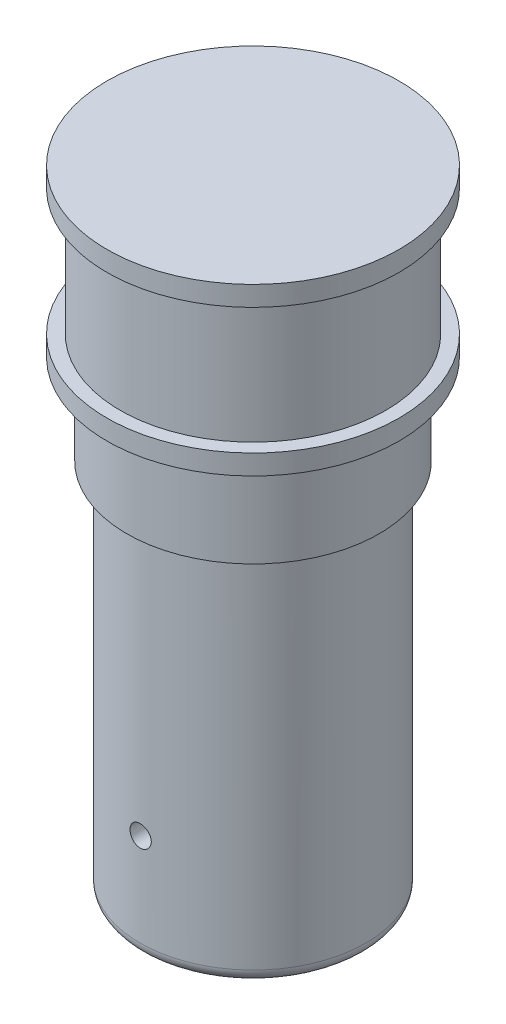
ISO-10303-21;
HEADER;
FILE_DESCRIPTION(('STEP AP214'),'2;1');
FILE_NAME('part.step','',(''),(''),'','','');
FILE_SCHEMA(('AUTOMOTIVE_DESIGN { 1 0 10303 214 1 1 1 1 }'));
ENDSEC;
DATA;
#1=APPLICATION_CONTEXT('core data for automotive mechanical design processes');
#2=APPLICATION_PROTOCOL_DEFINITION('international standard','automotive_design',2000,#1);
#3=PRODUCT_CONTEXT('',#1,'mechanical');
#4=PRODUCT('Part','Part','',(#3));
#5=PRODUCT_RELATED_PRODUCT_CATEGORY('part','',(#4));
#6=PRODUCT_DEFINITION_FORMATION('','',#4);
#7=PRODUCT_DEFINITION_CONTEXT('part definition',#1,'design');
#8=PRODUCT_DEFINITION('design','',#6,#7);
#9=PRODUCT_DEFINITION_SHAPE('','',#8);
#10=(LENGTH_UNIT() NAMED_UNIT(*) SI_UNIT(.MILLI.,.METRE.));
#11=(NAMED_UNIT(*) PLANE_ANGLE_UNIT() SI_UNIT($,.RADIAN.));
#12=(NAMED_UNIT(*) SI_UNIT($,.STERADIAN.) SOLID_ANGLE_UNIT());
#13=UNCERTAINTY_MEASURE_WITH_UNIT(LENGTH_MEASURE(1.E-05),#10,'distance_accuracy_value','');
#14=(GEOMETRIC_REPRESENTATION_CONTEXT(3) GLOBAL_UNCERTAINTY_ASSIGNED_CONTEXT((#13)) GLOBAL_UNIT_ASSIGNED_CONTEXT((#10,
#11,#12)) REPRESENTATION_CONTEXT('',''));
#15=CARTESIAN_POINT('',(0.,0.,0.));
#16=DIRECTION('',(0.,0.,1.));
#17=DIRECTION('',(1.,0.,0.));
#18=AXIS2_PLACEMENT_3D('',#15,#16,#17);
#19=CARTESIAN_POINT('',(0.,-21.,0.));
#20=DIRECTION('',(0.,-1.,0.));
#21=DIRECTION('',(1.,0.,0.));
#22=AXIS2_PLACEMENT_3D('',#19,#20,#21);
#23=PLANE('',#22);
#24=CARTESIAN_POINT('',(0.,-21.,0.));
#25=DIRECTION('',(0.,1.,0.));
#26=DIRECTION('',(-1.,0.,0.));
#27=AXIS2_PLACEMENT_3D('',#24,#25,#26);
#28=CIRCLE('',#27,4.);
#29=CARTESIAN_POINT('',(-4.,-21.,0.));
#30=VERTEX_POINT('',#29);
#31=EDGE_CURVE('E67',#30,#30,#28,.T.);
#32=ORIENTED_EDGE('',*,*,#31,.F.);
#33=EDGE_LOOP('',(#32));
#34=FACE_BOUND('',#33,.T.);
#35=ADVANCED_FACE('F43',(#34),#23,.T.);
#36=CARTESIAN_POINT('',(0.,12.5,0.));
#37=DIRECTION('',(0.,1.,0.));
#38=DIRECTION('',(-1.,0.,0.));
#39=AXIS2_PLACEMENT_3D('',#36,#37,#38);
#40=CYLINDRICAL_SURFACE('',#39,4.);
#41=CARTESIAN_POINT('',(-0.799999999999998,-27.,3.91918358845308));
#42=CARTESIAN_POINT('',(-0.799998356700835,-26.9555484996144,3.91918447235146));
#43=CARTESIAN_POINT('',(-0.796282537378923,-26.9110763013548,3.9199480667753));
#44=CARTESIAN_POINT('',(-0.781529826870666,-26.8233899959053,3.9229154510821));
#45=CARTESIAN_POINT('',(-0.770487077656943,-26.7801769242951,3.92512039333066));
#46=CARTESIAN_POINT('',(-0.741436626094187,-26.6962901573097,3.93071098960285));
#47=CARTESIAN_POINT('',(-0.723435851321662,-26.6556139827721,3.9340954689225));
#48=CARTESIAN_POINT('',(-0.68099928613683,-26.5778601242443,3.94166239589137));
#49=CARTESIAN_POINT('',(-0.656563854881033,-26.5407822395702,3.94584479900011));
#50=CARTESIAN_POINT('',(-0.601583260522627,-26.4707511969164,3.95460239754144));
#51=CARTESIAN_POINT('',(-0.570964524730618,-26.4378563296927,3.9591819026946));
#52=CARTESIAN_POINT('',(-0.504645431217074,-26.377633973137,3.96817977842416));
#53=CARTESIAN_POINT('',(-0.468944717582391,-26.3503068740663,3.97259813768756));
#54=CARTESIAN_POINT('',(-0.393089084739392,-26.3017695858972,3.98082237133958));
#55=CARTESIAN_POINT('',(-0.352898054137762,-26.2806147889467,3.98462257153216));
#56=CARTESIAN_POINT('',(-0.269443320309816,-26.2453800503615,3.9911338950693));
#57=CARTESIAN_POINT('',(-0.22617990513644,-26.2312994464792,3.99384512035302));
#58=CARTESIAN_POINT('',(-0.138413418622792,-26.2107942451043,3.99784256550728));
#59=CARTESIAN_POINT('',(-0.0939341913718486,-26.2042712179432,3.999147090305));
#60=CARTESIAN_POINT('',(-0.00449485475002674,-26.1987592385294,4.00024736946885));
#61=CARTESIAN_POINT('',(0.040465207865477,-26.1997695602834,4.00004326922208));
#62=CARTESIAN_POINT('',(0.128913600594874,-26.2092209441725,3.99816347894812));
#63=CARTESIAN_POINT('',(0.172413771438779,-26.2175559817343,3.99650878692671));
#64=CARTESIAN_POINT('',(0.257385301264243,-26.2412520259671,3.99193741727527));
#65=CARTESIAN_POINT('',(0.298856578997705,-26.2566133137535,3.98902068915231));
#66=CARTESIAN_POINT('',(0.378895570560712,-26.2940240321178,3.98221836815967));
#67=CARTESIAN_POINT('',(0.417443339307122,-26.3161150008839,3.97832678540179));
#68=CARTESIAN_POINT('',(0.490324036687806,-26.3663272617893,3.97000375579028));
#69=CARTESIAN_POINT('',(0.524656479620001,-26.3944492478164,3.96557224684178));
#70=CARTESIAN_POINT('',(0.588761144842767,-26.4565068976868,3.95656771491568));
#71=CARTESIAN_POINT('',(0.618443453258906,-26.4905353493837,3.95199357166013));
#72=CARTESIAN_POINT('',(0.671694794541447,-26.5631331539606,3.94329257279008));
#73=CARTESIAN_POINT('',(0.695263711782202,-26.6017025927066,3.93916572563639));
#74=CARTESIAN_POINT('',(0.735650251841506,-26.6824166654575,3.93182437978339));
#75=CARTESIAN_POINT('',(0.752453318222168,-26.7245687741117,3.92861185250839));
#76=CARTESIAN_POINT('',(0.778712273302065,-26.8111770589792,3.92349181057018));
#77=CARTESIAN_POINT('',(0.788169119565313,-26.8556329340953,3.92158412582742));
#78=CARTESIAN_POINT('',(0.79933280482884,-26.9447718863992,3.91932383414262));
#79=CARTESIAN_POINT('',(0.801169487118328,-26.9894380594483,3.91894517645723));
#80=CARTESIAN_POINT('',(0.797390102648589,-27.0784385785598,3.91971588551083));
#81=CARTESIAN_POINT('',(0.791774458497952,-27.1227729432951,3.92086516560311));
#82=CARTESIAN_POINT('',(0.773361766459323,-27.2094149122338,3.92453785995932));
#83=CARTESIAN_POINT('',(0.760634096671436,-27.2517378744286,3.92704799211598));
#84=CARTESIAN_POINT('',(0.728432828246811,-27.333650623223,3.93314791481332));
#85=CARTESIAN_POINT('',(0.708958673898538,-27.3732401843486,3.93673779429016));
#86=CARTESIAN_POINT('',(0.663523313772475,-27.4491304879601,3.94465124769632));
#87=CARTESIAN_POINT('',(0.6374808623862,-27.4853816370407,3.94898377491923));
#88=CARTESIAN_POINT('',(0.579756457770166,-27.5530466496007,3.95786979061309));
#89=CARTESIAN_POINT('',(0.548073924115625,-27.5844600145994,3.96242330179054));
#90=CARTESIAN_POINT('',(0.479385818798307,-27.6420500473485,3.97132276695372));
#91=CARTESIAN_POINT('',(0.442305999143699,-27.66813892372,3.97566446166947));
#92=CARTESIAN_POINT('',(0.3642143173078,-27.7137167051997,3.98357702102896));
#93=CARTESIAN_POINT('',(0.323202620346801,-27.7332058874758,3.98714791804169));
#94=CARTESIAN_POINT('',(0.238642144659206,-27.7649030973973,3.99309835248853));
#95=CARTESIAN_POINT('',(0.195109338782458,-27.777152414581,3.99548463314083));
#96=CARTESIAN_POINT('',(0.106551563743926,-27.7941529981311,3.99882588750128));
#97=CARTESIAN_POINT('',(0.0615267749689674,-27.7989051675805,3.99978103359875));
#98=CARTESIAN_POINT('',(-0.0278983151229024,-27.8007415847703,4.00014832363297));
#99=CARTESIAN_POINT('',(-0.0722958497132053,-27.797957824365,3.99958702839481));
#100=CARTESIAN_POINT('',(-0.159976825052516,-27.7850928395618,3.99704034848254));
#101=CARTESIAN_POINT('',(-0.203260279802956,-27.7750117069215,3.99505498171481));
#102=CARTESIAN_POINT('',(-0.287402199796079,-27.7478968063267,3.98988398692));
#103=CARTESIAN_POINT('',(-0.328265954592227,-27.730878897495,3.9867010979833));
#104=CARTESIAN_POINT('',(-0.406576976148764,-27.6903902069353,3.97947777698706));
#105=CARTESIAN_POINT('',(-0.44402397261393,-27.666918915277,3.97543727716702));
#106=CARTESIAN_POINT('',(-0.515091112085087,-27.6137444903503,3.96686079326295));
#107=CARTESIAN_POINT('',(-0.548639772893204,-27.5839469308906,3.96231786737714));
#108=CARTESIAN_POINT('',(-0.610306094205478,-27.5191598079234,3.95328978322898));
#109=CARTESIAN_POINT('',(-0.638422466562171,-27.484169016425,3.948804638903));
#110=CARTESIAN_POINT('',(-0.688713775564161,-27.4095365466399,3.94034674199971));
#111=CARTESIAN_POINT('',(-0.710821451711815,-27.3698488310717,3.93638002905062));
#112=CARTESIAN_POINT('',(-0.748019239430247,-27.2872537813602,3.92948189747556));
#113=CARTESIAN_POINT('',(-0.763115716783431,-27.2443494090417,3.92654954029565));
#114=CARTESIAN_POINT('',(-0.782935311883417,-27.1677900356507,3.92263744903138));
#115=CARTESIAN_POINT('',(-0.789323118818387,-27.1345716643908,3.92135027932529));
#116=CARTESIAN_POINT('',(-0.797856014368326,-27.0675728363571,3.91962302766424));
#117=CARTESIAN_POINT('',(-0.800001249249642,-27.0337923990015,3.91918291650621));
#118=CARTESIAN_POINT('',(-0.799999999999998,-27.,3.91918358845308));
#119=B_SPLINE_CURVE_WITH_KNOTS('',3,(#41,#42,#43,#44,#45,#46,#47,#48,#49,#50,#51,#52,#53,#54,
#55,#56,#57,#58,#59,#60,#61,#62,#63,#64,#65,#66,#67,#68,#69,#70,#71,#72,#73,#74,#75,#76,#77,#78,
#79,#80,#81,#82,#83,#84,#85,#86,#87,#88,#89,#90,#91,#92,#93,#94,#95,#96,#97,#98,#99,#100,#101,
#102,#103,#104,#105,#106,#107,#108,#109,#110,#111,#112,#113,#114,#115,#116,#117,#118),
.UNSPECIFIED.,.T.,.F.,(4,2,2,2,2,2,2,2,2,2,2,2,2,2,2,2,2,2,2,2,2,2,2,2,2,2,2,2,2,2,2,2,2,2,2,2,
2,2,4),(0.,0.133230771085221,0.266568191407413,0.399773198332446,0.532970771867871,
0.667858020367472,0.80275472026335,0.938827203479577,1.07488694595245,1.20915399104462,
1.34340809690996,1.47575031704827,1.60809783256998,1.7412793937584,1.8744762861405,
2.00999477407984,2.14551582496174,2.28132690536219,2.41712028010817,2.55059006241672,
2.68405227620734,2.81623473424652,2.94842808281516,3.08234447817614,3.21627466294164,
3.35226081384758,3.48824125302081,3.62343850860917,3.75861947751299,3.89144813929746,
4.02427513091402,4.15680013658358,4.28933561705744,4.42400921618474,4.55871471109822,
4.6948711886123,4.83090380069143,4.93219042907513,5.03347356545368),.UNSPECIFIED.);
#120=CARTESIAN_POINT('',(-0.799999999999998,-27.,3.91918358845308));
#121=VERTEX_POINT('',#120);
#122=EDGE_CURVE('E107',#121,#121,#119,.T.);
#123=ORIENTED_EDGE('',*,*,#122,.F.);
#124=EDGE_LOOP('',(#123));
#125=FACE_BOUND('',#124,.T.);
#126=CARTESIAN_POINT('',(0.,-34.,0.));
#127=DIRECTION('',(0.,-1.,0.));
#128=DIRECTION('',(1.,0.,0.));
#129=AXIS2_PLACEMENT_3D('',#126,#127,#128);
#130=CIRCLE('',#129,4.);
#131=CARTESIAN_POINT('',(4.,-34.,0.));
#132=VERTEX_POINT('',#131);
#133=EDGE_CURVE('E10',#132,#132,#130,.T.);
#134=ORIENTED_EDGE('',*,*,#133,.T.);
#135=EDGE_LOOP('',(#134));
#136=FACE_BOUND('',#135,.T.);
#137=ORIENTED_EDGE('',*,*,#31,.T.);
#138=EDGE_LOOP('',(#137));
#139=FACE_BOUND('',#138,.T.);
#140=ADVANCED_FACE('F121',(#125,#136,#139),#40,.F.);
#141=CARTESIAN_POINT('',(-4.,-35.,0.));
#142=DIRECTION('',(0.,-1.,0.));
#143=DIRECTION('',(1.,0.,0.));
#144=AXIS2_PLACEMENT_3D('',#141,#142,#143);
#145=PLANE('',#144);
#146=CARTESIAN_POINT('',(0.,-35.,0.));
#147=DIRECTION('',(0.,-1.,0.));
#148=DIRECTION('',(1.,0.,0.));
#149=AXIS2_PLACEMENT_3D('',#146,#147,#148);
#150=CIRCLE('',#149,7.5);
#151=CARTESIAN_POINT('',(7.5,-35.,0.));
#152=VERTEX_POINT('',#151);
#153=EDGE_CURVE('E51',#152,#152,#150,.T.);
#154=ORIENTED_EDGE('',*,*,#153,.T.);
#155=EDGE_LOOP('',(#154));
#156=FACE_BOUND('',#155,.T.);
#157=CARTESIAN_POINT('',(0.,-35.,0.));
#158=DIRECTION('',(0.,-1.,0.));
#159=DIRECTION('',(1.,0.,0.));
#160=AXIS2_PLACEMENT_3D('',#157,#158,#159);
#161=CIRCLE('',#160,5.);
#162=CARTESIAN_POINT('',(5.,-35.,0.));
#163=VERTEX_POINT('',#162);
#164=EDGE_CURVE('E56',#163,#163,#161,.F.);
#165=ORIENTED_EDGE('',*,*,#164,.T.);
#166=EDGE_LOOP('',(#165));
#167=FACE_BOUND('',#166,.T.);
#168=ADVANCED_FACE('F171',(#156,#167),#145,.T.);
#169=CARTESIAN_POINT('',(0.,12.5,0.));
#170=DIRECTION('',(0.,1.,0.));
#171=DIRECTION('',(-1.,0.,0.));
#172=AXIS2_PLACEMENT_3D('',#169,#170,#171);
#173=CYLINDRICAL_SURFACE('',#172,8.5);
#174=CARTESIAN_POINT('',(-0.799999999999998,-27.,8.46226919921601));
#175=CARTESIAN_POINT('',(-0.799998051722512,-27.0448294504744,8.46226969576411));
#176=CARTESIAN_POINT('',(-0.796219165065747,-27.0896888705062,8.46262926748447));
#177=CARTESIAN_POINT('',(-0.781200993113277,-27.1781649174772,8.46402857330807));
#178=CARTESIAN_POINT('',(-0.769953399606894,-27.2217801039114,8.46506906484979));
#179=CARTESIAN_POINT('',(-0.740327396358507,-27.3064735463154,8.46771133055027));
#180=CARTESIAN_POINT('',(-0.72195320484328,-27.3475532863724,8.46931277262869));
#181=CARTESIAN_POINT('',(-0.678603466147718,-27.4260364054319,8.47289608609246));
#182=CARTESIAN_POINT('',(-0.653629267431376,-27.463440533269,8.4748778797446));
#183=CARTESIAN_POINT('',(-0.597701438818433,-27.5336409476072,8.47900578910204));
#184=CARTESIAN_POINT('',(-0.566730820426075,-27.5664236740419,8.48115236095883));
#185=CARTESIAN_POINT('',(-0.499725485884903,-27.6263340325935,8.48536380908184));
#186=CARTESIAN_POINT('',(-0.463690542103846,-27.6534614103765,8.48742868167047));
#187=CARTESIAN_POINT('',(-0.387497096107427,-27.7013373241769,8.49124852243702));
#188=CARTESIAN_POINT('',(-0.347331076049269,-27.7220739460507,8.49300290922283));
#189=CARTESIAN_POINT('',(-0.264067927363776,-27.7565034981943,8.49599915855955));
#190=CARTESIAN_POINT('',(-0.220970862667865,-27.7701965820408,8.49724103228512));
#191=CARTESIAN_POINT('',(-0.133205360945529,-27.790110830208,8.49906913274005));
#192=CARTESIAN_POINT('',(-0.0885419946435129,-27.7963541607352,8.49965730415378));
#193=CARTESIAN_POINT('',(0.00120227418408964,-27.8012602399367,8.50011833475565));
#194=CARTESIAN_POINT('',(0.0462831670020067,-27.7999231644192,8.49999121053323));
#195=CARTESIAN_POINT('',(0.135432398645046,-27.7897244295111,8.49903756962443));
#196=CARTESIAN_POINT('',(0.179503491284394,-27.7808866057248,8.49821326843021));
#197=CARTESIAN_POINT('',(0.265534024050678,-27.7559743541366,8.49596048642509));
#198=CARTESIAN_POINT('',(0.307493439447392,-27.7398998416065,8.49453199854028));
#199=CARTESIAN_POINT('',(0.388184944500132,-27.7009442134983,8.49122767231171));
#200=CARTESIAN_POINT('',(0.42691188948564,-27.6780525027847,8.48935113853183));
#201=CARTESIAN_POINT('',(0.499982995623227,-27.6261199827266,8.48536140315661));
#202=CARTESIAN_POINT('',(0.534327042989772,-27.5970790137916,8.48324819541961));
#203=CARTESIAN_POINT('',(0.597796970011164,-27.5335381844106,8.47901271675067));
#204=CARTESIAN_POINT('',(0.626902104101886,-27.499017597794,8.47689044244263));
#205=CARTESIAN_POINT('',(0.678907530961674,-27.4255694435251,8.47288422269225));
#206=CARTESIAN_POINT('',(0.701807816327674,-27.3866418706149,8.47100027753427));
#207=CARTESIAN_POINT('',(0.740753132706013,-27.3054693259134,8.46768378909325));
#208=CARTESIAN_POINT('',(0.756796958762964,-27.2632237725626,8.46625132516519));
#209=CARTESIAN_POINT('',(0.781557909956947,-27.1766219934651,8.46400160564135));
#210=CARTESIAN_POINT('',(0.790275232342148,-27.1322658245756,8.46318433348309));
#211=CARTESIAN_POINT('',(0.800109195830604,-27.0428838260686,8.46226033917821));
#212=CARTESIAN_POINT('',(0.801254825170939,-26.9978612126451,8.46215090709925));
#213=CARTESIAN_POINT('',(0.795988938910484,-26.9082646263525,8.46264783208173));
#214=CARTESIAN_POINT('',(0.789577513570648,-26.8636906481313,8.46325418059395));
#215=CARTESIAN_POINT('',(0.769403735601286,-26.7763406430786,8.4651118796448));
#216=CARTESIAN_POINT('',(0.755655022983686,-26.7335614384168,8.46636203319978));
#217=CARTESIAN_POINT('',(0.721210848959738,-26.6509166722136,8.46936550354304));
#218=CARTESIAN_POINT('',(0.700515246112518,-26.6110511700162,8.47111883057599));
#219=CARTESIAN_POINT('',(0.652691871459721,-26.5352331189511,8.47493765726395));
#220=CARTESIAN_POINT('',(0.625544850059143,-26.4992927594832,8.47700408432026));
#221=CARTESIAN_POINT('',(0.565616911529256,-26.4324686633566,8.48121320580404));
#222=CARTESIAN_POINT('',(0.532835870865707,-26.4015850376034,8.48335590190302));
#223=CARTESIAN_POINT('',(0.462444852074466,-26.3456514961313,8.48748427411384));
#224=CARTESIAN_POINT('',(0.424819835056008,-26.3206204626659,8.48946942870376));
#225=CARTESIAN_POINT('',(0.345883423508185,-26.2772324383319,8.49305148216123));
#226=CARTESIAN_POINT('',(0.30457207444818,-26.2588753651568,8.49464838581678));
#227=CARTESIAN_POINT('',(0.219502240600618,-26.22938850786,8.49727163876449));
#228=CARTESIAN_POINT('',(0.175747773139532,-26.2182472177639,8.49829889601202));
#229=CARTESIAN_POINT('',(0.0869790829470731,-26.2034706151011,8.49967082390552));
#230=CARTESIAN_POINT('',(0.0419648913231358,-26.199835117353,8.5000155113917));
#231=CARTESIAN_POINT('',(-0.0478597500803894,-26.2001757325819,8.49998346741485));
#232=CARTESIAN_POINT('',(-0.092670315071325,-26.2041224905255,8.49960951818341));
#233=CARTESIAN_POINT('',(-0.180988972181253,-26.2194541543759,8.4981877095337));
#234=CARTESIAN_POINT('',(-0.224497062973241,-26.2308390678607,8.49713984942885));
#235=CARTESIAN_POINT('',(-0.308976287688145,-26.2607159765181,8.49448768250067));
#236=CARTESIAN_POINT('',(-0.34994768491388,-26.2792072326282,8.49288343354369));
#237=CARTESIAN_POINT('',(-0.428209622450277,-26.3227687314572,8.48929755730403));
#238=CARTESIAN_POINT('',(-0.465500197901196,-26.3478389113598,8.48731593362462));
#239=CARTESIAN_POINT('',(-0.535492360861083,-26.4039568083287,8.48318829962731));
#240=CARTESIAN_POINT('',(-0.568176415559753,-26.4350263503164,8.48104170688272));
#241=CARTESIAN_POINT('',(-0.627880694936033,-26.5022190268229,8.47683101907694));
#242=CARTESIAN_POINT('',(-0.654899554082033,-26.5383433762554,8.47476694400251));
#243=CARTESIAN_POINT('',(-0.70255398644443,-26.6147092230948,8.47094991592882));
#244=CARTESIAN_POINT('',(-0.723174805318652,-26.6549599562504,8.46919768597343));
#245=CARTESIAN_POINT('',(-0.757338072342069,-26.7383427331831,8.46621142126264));
#246=CARTESIAN_POINT('',(-0.770888562085651,-26.7814714403578,8.46497679811132));
#247=CARTESIAN_POINT('',(-0.787120432851147,-26.8540402104196,8.46347920213285));
#248=CARTESIAN_POINT('',(-0.791943737627452,-26.8830152475015,8.46302757434083));
#249=CARTESIAN_POINT('',(-0.798384153084581,-26.941322576651,8.46242241090119));
#250=CARTESIAN_POINT('',(-0.800001275332632,-26.9706548674292,8.46226887417812));
#251=CARTESIAN_POINT('',(-0.799999999999998,-27.,8.46226919921601));
#252=B_SPLINE_CURVE_WITH_KNOTS('',3,(#174,#175,#176,#177,#178,#179,#180,#181,#182,#183,#184,
#185,#186,#187,#188,#189,#190,#191,#192,#193,#194,#195,#196,#197,#198,#199,#200,#201,#202,#203,
#204,#205,#206,#207,#208,#209,#210,#211,#212,#213,#214,#215,#216,#217,#218,#219,#220,#221,#222,
#223,#224,#225,#226,#227,#228,#229,#230,#231,#232,#233,#234,#235,#236,#237,#238,#239,#240,#241,
#242,#243,#244,#245,#246,#247,#248,#249,#250,#251),.UNSPECIFIED.,.T.,.F.,(4,2,2,2,2,2,2,2,2,2,2,
2,2,2,2,2,2,2,2,2,2,2,2,2,2,2,2,2,2,2,2,2,2,2,2,2,2,2,4),(0.,0.134381195279678,0.26891212756854,
0.40336355234361,0.53778752822052,0.672598066512268,0.807414666232375,0.942481102024313,
1.07754459271543,1.21220520152603,1.34686268724088,1.48109385862725,1.61532660165271,
1.7497690647165,1.88421501736596,2.01918218015634,2.15414950397668,2.28914053723452,
2.42412793607294,2.55859823460517,2.69306692704944,2.82728650864341,2.9615088231561,
3.09613676990319,3.2307676689447,3.36582711281156,3.50088489100705,3.63572677823608,
3.77056533863313,3.90488291751552,4.03920063324043,4.17350438364815,4.30780685175388,
4.4426074272734,4.57744045769637,4.71258215065692,4.84756980033525,4.93553537153734,
5.02350062537776),.UNSPECIFIED.);
#253=CARTESIAN_POINT('',(-0.799999999999998,-27.,8.46226919921601));
#254=VERTEX_POINT('',#253);
#255=EDGE_CURVE('E116',#254,#254,#252,.T.);
#256=ORIENTED_EDGE('',*,*,#255,.F.);
#257=EDGE_LOOP('',(#256));
#258=FACE_BOUND('',#257,.T.);
#259=CARTESIAN_POINT('',(0.,-34.,0.));
#260=DIRECTION('',(0.,-1.,0.));
#261=DIRECTION('',(1.,0.,0.));
#262=AXIS2_PLACEMENT_3D('',#259,#260,#261);
#263=CIRCLE('',#262,8.5);
#264=CARTESIAN_POINT('',(8.5,-34.,0.));
#265=VERTEX_POINT('',#264);
#266=EDGE_CURVE('E61',#265,#265,#263,.F.);
#267=ORIENTED_EDGE('',*,*,#266,.T.);
#268=EDGE_LOOP('',(#267));
#269=FACE_BOUND('',#268,.T.);
#270=CARTESIAN_POINT('',(0.,-6.8,0.));
#271=DIRECTION('',(0.,1.,0.));
#272=DIRECTION('',(-1.,0.,0.));
#273=AXIS2_PLACEMENT_3D('',#270,#271,#272);
#274=CIRCLE('',#273,8.49999999999999);
#275=CARTESIAN_POINT('',(-8.49999999999999,-6.8,0.));
#276=VERTEX_POINT('',#275);
#277=EDGE_CURVE('E71',#276,#276,#274,.T.);
#278=ORIENTED_EDGE('',*,*,#277,.F.);
#279=EDGE_LOOP('',(#278));
#280=FACE_BOUND('',#279,.T.);
#281=ADVANCED_FACE('F168',(#258,#269,#280),#173,.T.);
#282=CARTESIAN_POINT('',(-8.49999999999999,-6.8,0.));
#283=DIRECTION('',(0.,-1.,0.));
#284=DIRECTION('',(1.,0.,0.));
#285=AXIS2_PLACEMENT_3D('',#282,#283,#284);
#286=PLANE('',#285);
#287=ORIENTED_EDGE('',*,*,#277,.T.);
#288=EDGE_LOOP('',(#287));
#289=FACE_BOUND('',#288,.T.);
#290=CARTESIAN_POINT('',(0.,-6.8,0.));
#291=DIRECTION('',(0.,1.,0.));
#292=DIRECTION('',(-1.,0.,0.));
#293=AXIS2_PLACEMENT_3D('',#290,#291,#292);
#294=CIRCLE('',#293,9.49999999999999);
#295=CARTESIAN_POINT('',(-9.49999999999999,-6.8,0.));
#296=VERTEX_POINT('',#295);
#297=EDGE_CURVE('E75',#296,#296,#294,.T.);
#298=ORIENTED_EDGE('',*,*,#297,.F.);
#299=EDGE_LOOP('',(#298));
#300=FACE_BOUND('',#299,.T.);
#301=ADVANCED_FACE('F164',(#289,#300),#286,.T.);
#302=CARTESIAN_POINT('',(0.,12.5,0.));
#303=DIRECTION('',(0.,1.,0.));
#304=DIRECTION('',(-1.,0.,0.));
#305=AXIS2_PLACEMENT_3D('',#302,#303,#304);
#306=CYLINDRICAL_SURFACE('',#305,9.49999999999999);
#307=ORIENTED_EDGE('',*,*,#297,.T.);
#308=EDGE_LOOP('',(#307));
#309=FACE_BOUND('',#308,.T.);
#310=CARTESIAN_POINT('',(0.,0.,0.));
#311=DIRECTION('',(0.,1.,0.));
#312=DIRECTION('',(-1.,0.,0.));
#313=AXIS2_PLACEMENT_3D('',#310,#311,#312);
#314=CIRCLE('',#313,9.49999999999999);
#315=CARTESIAN_POINT('',(-9.49999999999999,0.,0.));
#316=VERTEX_POINT('',#315);
#317=EDGE_CURVE('E79',#316,#316,#314,.T.);
#318=ORIENTED_EDGE('',*,*,#317,.F.);
#319=EDGE_LOOP('',(#318));
#320=FACE_BOUND('',#319,.T.);
#321=ADVANCED_FACE('F160',(#309,#320),#306,.T.);
#322=CARTESIAN_POINT('',(-9.49999999999999,0.,0.));
#323=DIRECTION('',(0.,-1.,0.));
#324=DIRECTION('',(1.,0.,0.));
#325=AXIS2_PLACEMENT_3D('',#322,#323,#324);
#326=PLANE('',#325);
#327=ORIENTED_EDGE('',*,*,#317,.T.);
#328=EDGE_LOOP('',(#327));
#329=FACE_BOUND('',#328,.T.);
#330=CARTESIAN_POINT('',(0.,0.,0.));
#331=DIRECTION('',(0.,1.,0.));
#332=DIRECTION('',(-1.,0.,0.));
#333=AXIS2_PLACEMENT_3D('',#330,#331,#332);
#334=CIRCLE('',#333,11.);
#335=CARTESIAN_POINT('',(-11.,0.,0.));
#336=VERTEX_POINT('',#335);
#337=EDGE_CURVE('E83',#336,#336,#334,.T.);
#338=ORIENTED_EDGE('',*,*,#337,.F.);
#339=EDGE_LOOP('',(#338));
#340=FACE_BOUND('',#339,.T.);
#341=ADVANCED_FACE('F156',(#329,#340),#326,.T.);
#342=CARTESIAN_POINT('',(0.,12.5,0.));
#343=DIRECTION('',(0.,1.,0.));
#344=DIRECTION('',(-1.,0.,0.));
#345=AXIS2_PLACEMENT_3D('',#342,#343,#344);
#346=CYLINDRICAL_SURFACE('',#345,11.);
#347=ORIENTED_EDGE('',*,*,#337,.T.);
#348=EDGE_LOOP('',(#347));
#349=FACE_BOUND('',#348,.T.);
#350=CARTESIAN_POINT('',(0.,1.5,0.));
#351=DIRECTION('',(0.,1.,0.));
#352=DIRECTION('',(-1.,0.,0.));
#353=AXIS2_PLACEMENT_3D('',#350,#351,#352);
#354=CIRCLE('',#353,11.);
#355=CARTESIAN_POINT('',(-11.,1.5,0.));
#356=VERTEX_POINT('',#355);
#357=EDGE_CURVE('E87',#356,#356,#354,.T.);
#358=ORIENTED_EDGE('',*,*,#357,.F.);
#359=EDGE_LOOP('',(#358));
#360=FACE_BOUND('',#359,.T.);
#361=ADVANCED_FACE('F152',(#349,#360),#346,.T.);
#362=CARTESIAN_POINT('',(-11.,1.5,0.));
#363=DIRECTION('',(0.,1.,0.));
#364=DIRECTION('',(-1.,0.,0.));
#365=AXIS2_PLACEMENT_3D('',#362,#363,#364);
#366=PLANE('',#365);
#367=ORIENTED_EDGE('',*,*,#357,.T.);
#368=EDGE_LOOP('',(#367));
#369=FACE_BOUND('',#368,.T.);
#370=CARTESIAN_POINT('',(0.,1.5,0.));
#371=DIRECTION('',(0.,1.,0.));
#372=DIRECTION('',(-1.,0.,0.));
#373=AXIS2_PLACEMENT_3D('',#370,#371,#372);
#374=CIRCLE('',#373,10.);
#375=CARTESIAN_POINT('',(-10.,1.5,0.));
#376=VERTEX_POINT('',#375);
#377=EDGE_CURVE('E91',#376,#376,#374,.T.);
#378=ORIENTED_EDGE('',*,*,#377,.F.);
#379=EDGE_LOOP('',(#378));
#380=FACE_BOUND('',#379,.T.);
#381=ADVANCED_FACE('F148',(#369,#380),#366,.T.);
#382=CARTESIAN_POINT('',(0.,12.5,0.));
#383=DIRECTION('',(0.,1.,0.));
#384=DIRECTION('',(-1.,0.,0.));
#385=AXIS2_PLACEMENT_3D('',#382,#383,#384);
#386=CYLINDRICAL_SURFACE('',#385,10.);
#387=ORIENTED_EDGE('',*,*,#377,.T.);
#388=EDGE_LOOP('',(#387));
#389=FACE_BOUND('',#388,.T.);
#390=CARTESIAN_POINT('',(0.,11.,0.));
#391=DIRECTION('',(0.,1.,0.));
#392=DIRECTION('',(-1.,0.,0.));
#393=AXIS2_PLACEMENT_3D('',#390,#391,#392);
#394=CIRCLE('',#393,10.);
#395=CARTESIAN_POINT('',(-10.,11.,0.));
#396=VERTEX_POINT('',#395);
#397=EDGE_CURVE('E95',#396,#396,#394,.T.);
#398=ORIENTED_EDGE('',*,*,#397,.F.);
#399=EDGE_LOOP('',(#398));
#400=FACE_BOUND('',#399,.T.);
#401=ADVANCED_FACE('F144',(#389,#400),#386,.T.);
#402=CARTESIAN_POINT('',(-10.,11.,0.));
#403=DIRECTION('',(0.,-1.,0.));
#404=DIRECTION('',(1.,0.,0.));
#405=AXIS2_PLACEMENT_3D('',#402,#403,#404);
#406=PLANE('',#405);
#407=ORIENTED_EDGE('',*,*,#397,.T.);
#408=EDGE_LOOP('',(#407));
#409=FACE_BOUND('',#408,.T.);
#410=CARTESIAN_POINT('',(0.,11.,0.));
#411=DIRECTION('',(0.,1.,0.));
#412=DIRECTION('',(-1.,0.,0.));
#413=AXIS2_PLACEMENT_3D('',#410,#411,#412);
#414=CIRCLE('',#413,11.);
#415=CARTESIAN_POINT('',(-11.,11.,0.));
#416=VERTEX_POINT('',#415);
#417=EDGE_CURVE('E99',#416,#416,#414,.T.);
#418=ORIENTED_EDGE('',*,*,#417,.F.);
#419=EDGE_LOOP('',(#418));
#420=FACE_BOUND('',#419,.T.);
#421=ADVANCED_FACE('F140',(#409,#420),#406,.T.);
#422=CARTESIAN_POINT('',(0.,12.5,0.));
#423=DIRECTION('',(0.,1.,0.));
#424=DIRECTION('',(-1.,0.,0.));
#425=AXIS2_PLACEMENT_3D('',#422,#423,#424);
#426=CYLINDRICAL_SURFACE('',#425,11.);
#427=ORIENTED_EDGE('',*,*,#417,.T.);
#428=EDGE_LOOP('',(#427));
#429=FACE_BOUND('',#428,.T.);
#430=CARTESIAN_POINT('',(0.,12.5,0.));
#431=DIRECTION('',(0.,1.,0.));
#432=DIRECTION('',(-1.,0.,0.));
#433=AXIS2_PLACEMENT_3D('',#430,#431,#432);
#434=CIRCLE('',#433,11.);
#435=CARTESIAN_POINT('',(-11.,12.5,0.));
#436=VERTEX_POINT('',#435);
#437=EDGE_CURVE('E103',#436,#436,#434,.T.);
#438=ORIENTED_EDGE('',*,*,#437,.F.);
#439=EDGE_LOOP('',(#438));
#440=FACE_BOUND('',#439,.T.);
#441=ADVANCED_FACE('F136',(#429,#440),#426,.T.);
#442=CARTESIAN_POINT('',(-11.,12.5,0.));
#443=DIRECTION('',(0.,1.,0.));
#444=DIRECTION('',(-1.,0.,0.));
#445=AXIS2_PLACEMENT_3D('',#442,#443,#444);
#446=PLANE('',#445);
#447=ORIENTED_EDGE('',*,*,#437,.T.);
#448=EDGE_LOOP('',(#447));
#449=FACE_BOUND('',#448,.T.);
#450=ADVANCED_FACE('F132',(#449),#446,.T.);
#451=CARTESIAN_POINT('',(0.,-34.,0.));
#452=DIRECTION('',(0.,-1.,0.));
#453=DIRECTION('',(1.,0.,0.));
#454=AXIS2_PLACEMENT_3D('',#451,#452,#453);
#455=TOROIDAL_SURFACE('',#454,7.5,1.);
#456=ORIENTED_EDGE('',*,*,#153,.F.);
#457=EDGE_LOOP('',(#456));
#458=FACE_BOUND('',#457,.T.);
#459=ORIENTED_EDGE('',*,*,#266,.F.);
#460=EDGE_LOOP('',(#459));
#461=FACE_BOUND('',#460,.T.);
#462=ADVANCED_FACE('F135',(#458,#461),#455,.T.);
#463=CARTESIAN_POINT('',(0.,-34.,0.));
#464=DIRECTION('',(0.,-1.,0.));
#465=DIRECTION('',(1.,0.,0.));
#466=AXIS2_PLACEMENT_3D('',#463,#464,#465);
#467=TOROIDAL_SURFACE('',#466,5.,1.);
#468=ORIENTED_EDGE('',*,*,#133,.F.);
#469=EDGE_LOOP('',(#468));
#470=FACE_BOUND('',#469,.T.);
#471=ORIENTED_EDGE('',*,*,#164,.F.);
#472=EDGE_LOOP('',(#471));
#473=FACE_BOUND('',#472,.T.);
#474=ADVANCED_FACE('F45',(#470,#473),#467,.T.);
#475=CARTESIAN_POINT('',(0.,-27.,0.));
#476=DIRECTION('',(0.,0.,-1.));
#477=DIRECTION('',(-1.,0.,0.));
#478=AXIS2_PLACEMENT_3D('',#475,#476,#477);
#479=CYLINDRICAL_SURFACE('',#478,0.799999999999998);
#480=ORIENTED_EDGE('',*,*,#122,.T.);
#481=EDGE_LOOP('',(#480));
#482=FACE_BOUND('',#481,.T.);
#483=ORIENTED_EDGE('',*,*,#255,.T.);
#484=EDGE_LOOP('',(#483));
#485=FACE_BOUND('',#484,.T.);
#486=ADVANCED_FACE('F125',(#482,#485),#479,.F.);
#487=CLOSED_SHELL('',(#35,#140,#168,#281,#301,#321,#341,#361,#381,#401,#421,#441,#450,#462,#474,#486));
#488=MANIFOLD_SOLID_BREP('B2',#487);
#489=ADVANCED_BREP_SHAPE_REPRESENTATION('',(#18,#488),#14);
#490=SHAPE_DEFINITION_REPRESENTATION(#9,#489);
ENDSEC;
END-ISO-10303-21;
